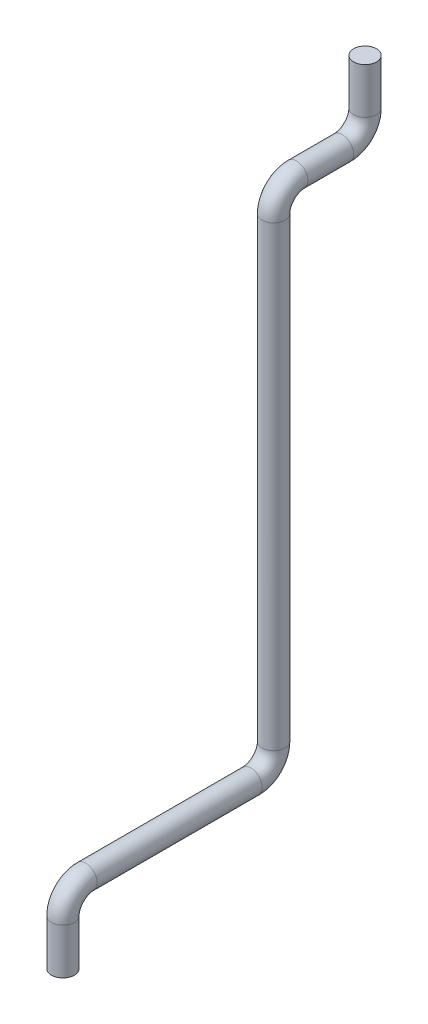
ISO-10303-21;
HEADER;
FILE_DESCRIPTION(('STEP AP214'),'2;1');
FILE_NAME('part.step','',(''),(''),'','','');
FILE_SCHEMA(('AUTOMOTIVE_DESIGN { 1 0 10303 214 1 1 1 1 }'));
ENDSEC;
DATA;
#1=APPLICATION_CONTEXT('core data for automotive mechanical design processes');
#2=APPLICATION_PROTOCOL_DEFINITION('international standard','automotive_design',2000,#1);
#3=PRODUCT_CONTEXT('',#1,'mechanical');
#4=PRODUCT('Part','Part','',(#3));
#5=PRODUCT_RELATED_PRODUCT_CATEGORY('part','',(#4));
#6=PRODUCT_DEFINITION_FORMATION('','',#4);
#7=PRODUCT_DEFINITION_CONTEXT('part definition',#1,'design');
#8=PRODUCT_DEFINITION('design','',#6,#7);
#9=PRODUCT_DEFINITION_SHAPE('','',#8);
#10=(LENGTH_UNIT() NAMED_UNIT(*) SI_UNIT(.MILLI.,.METRE.));
#11=(NAMED_UNIT(*) PLANE_ANGLE_UNIT() SI_UNIT($,.RADIAN.));
#12=(NAMED_UNIT(*) SI_UNIT($,.STERADIAN.) SOLID_ANGLE_UNIT());
#13=UNCERTAINTY_MEASURE_WITH_UNIT(LENGTH_MEASURE(1.E-05),#10,'distance_accuracy_value','');
#14=(GEOMETRIC_REPRESENTATION_CONTEXT(3) GLOBAL_UNCERTAINTY_ASSIGNED_CONTEXT((#13)) GLOBAL_UNIT_ASSIGNED_CONTEXT((#10,
#11,#12)) REPRESENTATION_CONTEXT('',''));
#15=CARTESIAN_POINT('',(0.,0.,0.));
#16=DIRECTION('',(0.,0.,1.));
#17=DIRECTION('',(1.,0.,0.));
#18=AXIS2_PLACEMENT_3D('',#15,#16,#17);
#19=CARTESIAN_POINT('',(0.,26.,-13.22));
#20=DIRECTION('',(0.,1.,0.));
#21=DIRECTION('',(0.,0.,1.));
#22=AXIS2_PLACEMENT_3D('',#19,#20,#21);
#23=CYLINDRICAL_SURFACE('',#22,0.5);
#24=CARTESIAN_POINT('',(0.,26.,-13.22));
#25=DIRECTION('',(0.,1.,0.));
#26=DIRECTION('',(0.,0.,1.));
#27=AXIS2_PLACEMENT_3D('',#24,#25,#26);
#28=CIRCLE('',#27,0.5);
#29=CARTESIAN_POINT('',(0.,26.,-13.72));
#30=VERTEX_POINT('',#29);
#31=EDGE_CURVE('E41',#30,#30,#28,.T.);
#32=ORIENTED_EDGE('',*,*,#31,.T.);
#33=EDGE_LOOP('',(#32));
#34=FACE_BOUND('',#33,.T.);
#35=CARTESIAN_POINT('',(0.,28.,-13.22));
#36=DIRECTION('',(0.,1.,0.));
#37=DIRECTION('',(0.,0.,1.));
#38=AXIS2_PLACEMENT_3D('',#35,#36,#37);
#39=CIRCLE('',#38,0.5);
#40=CARTESIAN_POINT('',(0.,28.,-12.72));
#41=VERTEX_POINT('',#40);
#42=EDGE_CURVE('E10',#41,#41,#39,.T.);
#43=ORIENTED_EDGE('',*,*,#42,.F.);
#44=EDGE_LOOP('',(#43));
#45=FACE_BOUND('',#44,.T.);
#46=ADVANCED_FACE('F35',(#34,#45),#23,.T.);
#47=CARTESIAN_POINT('',(0.,26.,-12.22));
#48=DIRECTION('',(1.,0.,0.));
#49=DIRECTION('',(0.,0.,-1.));
#50=AXIS2_PLACEMENT_3D('',#47,#48,#49);
#51=TOROIDAL_SURFACE('',#50,1.,0.5);
#52=CARTESIAN_POINT('',(0.,25.,-12.22));
#53=DIRECTION('',(0.,0.,-1.));
#54=DIRECTION('',(0.,1.,0.));
#55=AXIS2_PLACEMENT_3D('',#52,#53,#54);
#56=CIRCLE('',#55,0.5);
#57=CARTESIAN_POINT('',(0.,24.5,-12.22));
#58=VERTEX_POINT('',#57);
#59=EDGE_CURVE('E45',#58,#58,#56,.T.);
#60=CARTESIAN_POINT('',(0.,26.,-12.22));
#61=DIRECTION('',(1.,0.,0.));
#62=DIRECTION('',(0.,0.,-1.));
#63=AXIS2_PLACEMENT_3D('',#60,#61,#62);
#64=CIRCLE('',#63,1.5);
#65=EDGE_CURVE('',#58,#30,#64,.T.);
#66=ORIENTED_EDGE('',*,*,#59,.T.);
#67=ORIENTED_EDGE('',*,*,#31,.F.);
#68=ORIENTED_EDGE('',*,*,#65,.T.);
#69=ORIENTED_EDGE('',*,*,#65,.F.);
#70=EDGE_LOOP('',(#66,#68,#67,#69));
#71=FACE_BOUND('',#70,.T.);
#72=ADVANCED_FACE('F91',(#71),#51,.T.);
#73=CARTESIAN_POINT('',(0.,25.,-10.22));
#74=DIRECTION('',(0.,0.,-1.));
#75=DIRECTION('',(-1.,0.,0.));
#76=AXIS2_PLACEMENT_3D('',#73,#74,#75);
#77=CYLINDRICAL_SURFACE('',#76,0.5);
#78=CARTESIAN_POINT('',(0.,25.,-10.22));
#79=DIRECTION('',(0.,0.,-1.));
#80=DIRECTION('',(0.,1.,0.));
#81=AXIS2_PLACEMENT_3D('',#78,#79,#80);
#82=CIRCLE('',#81,0.5);
#83=CARTESIAN_POINT('',(0.,25.5,-10.22));
#84=VERTEX_POINT('',#83);
#85=EDGE_CURVE('E49',#84,#84,#82,.T.);
#86=ORIENTED_EDGE('',*,*,#85,.T.);
#87=EDGE_LOOP('',(#86));
#88=FACE_BOUND('',#87,.T.);
#89=ORIENTED_EDGE('',*,*,#59,.F.);
#90=EDGE_LOOP('',(#89));
#91=FACE_BOUND('',#90,.T.);
#92=ADVANCED_FACE('F95',(#88,#91),#77,.T.);
#93=CARTESIAN_POINT('',(0.,24.,-10.22));
#94=DIRECTION('',(-1.,0.,0.));
#95=DIRECTION('',(0.,0.,1.));
#96=AXIS2_PLACEMENT_3D('',#93,#94,#95);
#97=TOROIDAL_SURFACE('',#96,1.,0.5);
#98=CARTESIAN_POINT('',(0.,24.,-9.22));
#99=DIRECTION('',(0.,1.,0.));
#100=DIRECTION('',(0.,0.,1.));
#101=AXIS2_PLACEMENT_3D('',#98,#99,#100);
#102=CIRCLE('',#101,0.5);
#103=CARTESIAN_POINT('',(0.,24.,-8.72));
#104=VERTEX_POINT('',#103);
#105=EDGE_CURVE('E54',#104,#104,#102,.T.);
#106=CARTESIAN_POINT('',(0.,24.,-10.22));
#107=DIRECTION('',(-1.,0.,0.));
#108=DIRECTION('',(0.,0.,1.));
#109=AXIS2_PLACEMENT_3D('',#106,#107,#108);
#110=CIRCLE('',#109,1.5);
#111=EDGE_CURVE('',#104,#84,#110,.T.);
#112=ORIENTED_EDGE('',*,*,#105,.T.);
#113=ORIENTED_EDGE('',*,*,#85,.F.);
#114=ORIENTED_EDGE('',*,*,#111,.T.);
#115=ORIENTED_EDGE('',*,*,#111,.F.);
#116=EDGE_LOOP('',(#112,#114,#113,#115));
#117=FACE_BOUND('',#116,.T.);
#118=ADVANCED_FACE('F101',(#117),#97,.T.);
#119=CARTESIAN_POINT('',(0.,4.,-9.22));
#120=DIRECTION('',(0.,1.,0.));
#121=DIRECTION('',(0.,0.,1.));
#122=AXIS2_PLACEMENT_3D('',#119,#120,#121);
#123=CYLINDRICAL_SURFACE('',#122,0.5);
#124=CARTESIAN_POINT('',(0.,4.,-9.22));
#125=DIRECTION('',(0.,1.,0.));
#126=DIRECTION('',(0.,0.,1.));
#127=AXIS2_PLACEMENT_3D('',#124,#125,#126);
#128=CIRCLE('',#127,0.5);
#129=CARTESIAN_POINT('',(0.,4.,-9.72));
#130=VERTEX_POINT('',#129);
#131=EDGE_CURVE('E57',#130,#130,#128,.T.);
#132=ORIENTED_EDGE('',*,*,#131,.T.);
#133=EDGE_LOOP('',(#132));
#134=FACE_BOUND('',#133,.T.);
#135=ORIENTED_EDGE('',*,*,#105,.F.);
#136=EDGE_LOOP('',(#135));
#137=FACE_BOUND('',#136,.T.);
#138=ADVANCED_FACE('F108',(#134,#137),#123,.T.);
#139=CARTESIAN_POINT('',(0.,4.,-8.22));
#140=DIRECTION('',(1.,0.,0.));
#141=DIRECTION('',(0.,0.,-1.));
#142=AXIS2_PLACEMENT_3D('',#139,#140,#141);
#143=TOROIDAL_SURFACE('',#142,1.,0.5);
#144=CARTESIAN_POINT('',(0.,3.,-8.22));
#145=DIRECTION('',(0.,0.,-1.));
#146=DIRECTION('',(0.,1.,0.));
#147=AXIS2_PLACEMENT_3D('',#144,#145,#146);
#148=CIRCLE('',#147,0.5);
#149=CARTESIAN_POINT('',(0.,2.5,-8.22));
#150=VERTEX_POINT('',#149);
#151=EDGE_CURVE('E60',#150,#150,#148,.T.);
#152=CARTESIAN_POINT('',(0.,4.,-8.22));
#153=DIRECTION('',(1.,0.,0.));
#154=DIRECTION('',(0.,0.,-1.));
#155=AXIS2_PLACEMENT_3D('',#152,#153,#154);
#156=CIRCLE('',#155,1.5);
#157=EDGE_CURVE('',#150,#130,#156,.T.);
#158=ORIENTED_EDGE('',*,*,#151,.T.);
#159=ORIENTED_EDGE('',*,*,#131,.F.);
#160=ORIENTED_EDGE('',*,*,#157,.T.);
#161=ORIENTED_EDGE('',*,*,#157,.F.);
#162=EDGE_LOOP('',(#158,#160,#159,#161));
#163=FACE_BOUND('',#162,.T.);
#164=ADVANCED_FACE('F112',(#163),#143,.T.);
#165=CARTESIAN_POINT('',(0.,3.,-1.00000000000001));
#166=DIRECTION('',(0.,0.,-1.));
#167=DIRECTION('',(-1.,0.,0.));
#168=AXIS2_PLACEMENT_3D('',#165,#166,#167);
#169=CYLINDRICAL_SURFACE('',#168,0.5);
#170=CARTESIAN_POINT('',(0.,3.,-1.00000000000001));
#171=DIRECTION('',(0.,0.,-1.));
#172=DIRECTION('',(0.,1.,0.));
#173=AXIS2_PLACEMENT_3D('',#170,#171,#172);
#174=CIRCLE('',#173,0.5);
#175=CARTESIAN_POINT('',(0.,3.5,-1.00000000000001));
#176=VERTEX_POINT('',#175);
#177=EDGE_CURVE('E63',#176,#176,#174,.T.);
#178=ORIENTED_EDGE('',*,*,#177,.T.);
#179=EDGE_LOOP('',(#178));
#180=FACE_BOUND('',#179,.T.);
#181=ORIENTED_EDGE('',*,*,#151,.F.);
#182=EDGE_LOOP('',(#181));
#183=FACE_BOUND('',#182,.T.);
#184=ADVANCED_FACE('F116',(#180,#183),#169,.T.);
#185=CARTESIAN_POINT('',(0.,2.,-1.));
#186=DIRECTION('',(-1.,0.,0.));
#187=DIRECTION('',(0.,0.,1.));
#188=AXIS2_PLACEMENT_3D('',#185,#186,#187);
#189=TOROIDAL_SURFACE('',#188,1.,0.5);
#190=CARTESIAN_POINT('',(0.,1.99999999999999,0.));
#191=DIRECTION('',(0.,1.,0.));
#192=DIRECTION('',(0.,0.,1.));
#193=AXIS2_PLACEMENT_3D('',#190,#191,#192);
#194=CIRCLE('',#193,0.5);
#195=CARTESIAN_POINT('',(0.,1.99999999999999,0.5));
#196=VERTEX_POINT('',#195);
#197=EDGE_CURVE('E66',#196,#196,#194,.T.);
#198=CARTESIAN_POINT('',(0.,2.,-1.));
#199=DIRECTION('',(-1.,0.,0.));
#200=DIRECTION('',(0.,0.,1.));
#201=AXIS2_PLACEMENT_3D('',#198,#199,#200);
#202=CIRCLE('',#201,1.5);
#203=EDGE_CURVE('',#196,#176,#202,.T.);
#204=ORIENTED_EDGE('',*,*,#197,.T.);
#205=ORIENTED_EDGE('',*,*,#177,.F.);
#206=ORIENTED_EDGE('',*,*,#203,.T.);
#207=ORIENTED_EDGE('',*,*,#203,.F.);
#208=EDGE_LOOP('',(#204,#206,#205,#207));
#209=FACE_BOUND('',#208,.T.);
#210=ADVANCED_FACE('F73',(#209),#189,.T.);
#211=CARTESIAN_POINT('',(0.,1.99999999999999,0.));
#212=DIRECTION('',(0.,-1.,0.));
#213=DIRECTION('',(0.,0.,-1.));
#214=AXIS2_PLACEMENT_3D('',#211,#212,#213);
#215=CYLINDRICAL_SURFACE('',#214,0.5);
#216=ORIENTED_EDGE('',*,*,#197,.F.);
#217=EDGE_LOOP('',(#216));
#218=FACE_BOUND('',#217,.T.);
#219=CARTESIAN_POINT('',(0.,0.,0.));
#220=DIRECTION('',(0.,1.,0.));
#221=DIRECTION('',(0.,0.,1.));
#222=AXIS2_PLACEMENT_3D('',#219,#220,#221);
#223=CIRCLE('',#222,0.5);
#224=CARTESIAN_POINT('',(0.,0.,0.5));
#225=VERTEX_POINT('',#224);
#226=EDGE_CURVE('E67',#225,#225,#223,.T.);
#227=ORIENTED_EDGE('',*,*,#226,.T.);
#228=EDGE_LOOP('',(#227));
#229=FACE_BOUND('',#228,.T.);
#230=ADVANCED_FACE('F76',(#218,#229),#215,.T.);
#231=CARTESIAN_POINT('',(0.,28.,-13.22));
#232=DIRECTION('',(0.,1.,0.));
#233=DIRECTION('',(0.,0.,1.));
#234=AXIS2_PLACEMENT_3D('',#231,#232,#233);
#235=PLANE('',#234);
#236=ORIENTED_EDGE('',*,*,#42,.T.);
#237=EDGE_LOOP('',(#236));
#238=FACE_BOUND('',#237,.T.);
#239=ADVANCED_FACE('F79',(#238),#235,.T.);
#240=CARTESIAN_POINT('',(0.,0.,0.));
#241=DIRECTION('',(0.,1.,0.));
#242=DIRECTION('',(0.,0.,1.));
#243=AXIS2_PLACEMENT_3D('',#240,#241,#242);
#244=PLANE('',#243);
#245=ORIENTED_EDGE('',*,*,#226,.F.);
#246=EDGE_LOOP('',(#245));
#247=FACE_BOUND('',#246,.T.);
#248=ADVANCED_FACE('F83',(#247),#244,.F.);
#249=CLOSED_SHELL('',(#46,#72,#92,#118,#138,#164,#184,#210,#230,#239,#248));
#250=MANIFOLD_SOLID_BREP('B2',#249);
#251=ADVANCED_BREP_SHAPE_REPRESENTATION('',(#18,#250),#14);
#252=SHAPE_DEFINITION_REPRESENTATION(#9,#251);
ENDSEC;
END-ISO-10303-21;
